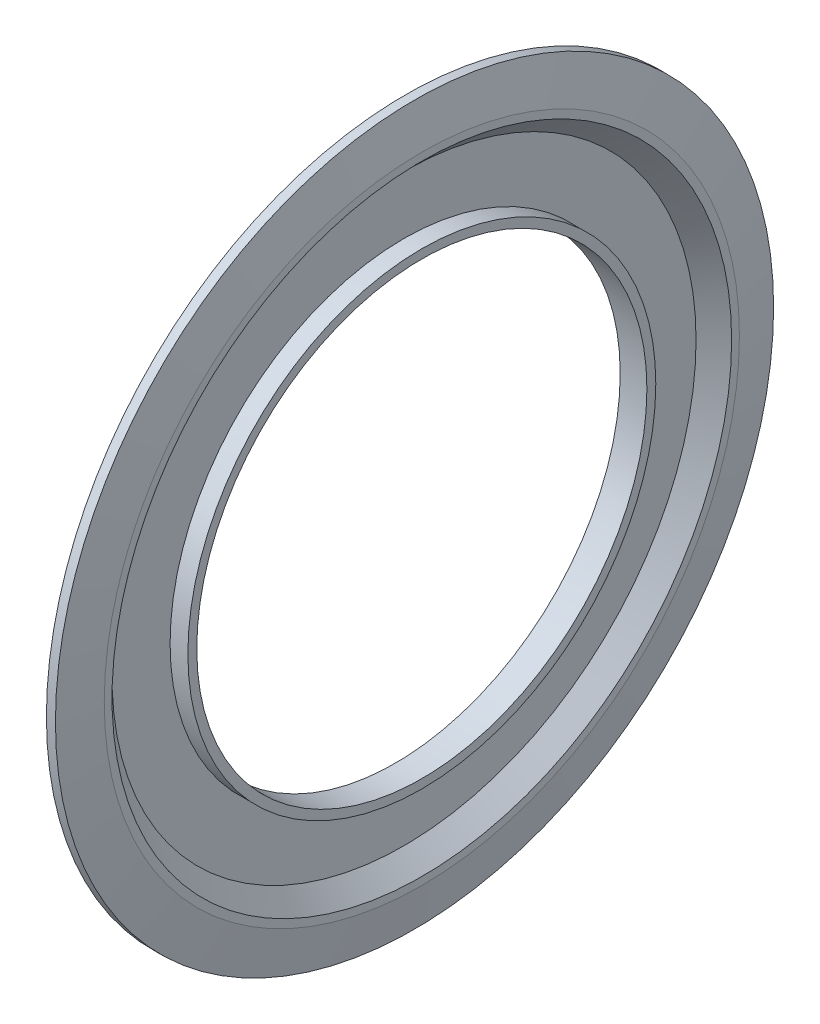
ISO-10303-21;
HEADER;
FILE_DESCRIPTION(('STEP AP214'),'2;1');
FILE_NAME('part.step','',(''),(''),'','','');
FILE_SCHEMA(('AUTOMOTIVE_DESIGN { 1 0 10303 214 1 1 1 1 }'));
ENDSEC;
DATA;
#1=APPLICATION_CONTEXT('core data for automotive mechanical design processes');
#2=APPLICATION_PROTOCOL_DEFINITION('international standard','automotive_design',2000,#1);
#3=PRODUCT_CONTEXT('',#1,'mechanical');
#4=PRODUCT('Part','Part','',(#3));
#5=PRODUCT_RELATED_PRODUCT_CATEGORY('part','',(#4));
#6=PRODUCT_DEFINITION_FORMATION('','',#4);
#7=PRODUCT_DEFINITION_CONTEXT('part definition',#1,'design');
#8=PRODUCT_DEFINITION('design','',#6,#7);
#9=PRODUCT_DEFINITION_SHAPE('','',#8);
#10=(LENGTH_UNIT() NAMED_UNIT(*) SI_UNIT(.MILLI.,.METRE.));
#11=(NAMED_UNIT(*) PLANE_ANGLE_UNIT() SI_UNIT($,.RADIAN.));
#12=(NAMED_UNIT(*) SI_UNIT($,.STERADIAN.) SOLID_ANGLE_UNIT());
#13=UNCERTAINTY_MEASURE_WITH_UNIT(LENGTH_MEASURE(1.E-05),#10,'distance_accuracy_value','');
#14=(GEOMETRIC_REPRESENTATION_CONTEXT(3) GLOBAL_UNCERTAINTY_ASSIGNED_CONTEXT((#13)) GLOBAL_UNIT_ASSIGNED_CONTEXT((#10,
#11,#12)) REPRESENTATION_CONTEXT('',''));
#15=CARTESIAN_POINT('',(0.,0.,0.));
#16=DIRECTION('',(0.,0.,1.));
#17=DIRECTION('',(1.,0.,0.));
#18=AXIS2_PLACEMENT_3D('',#15,#16,#17);
#19=CARTESIAN_POINT('',(0.410776862183425,0.,0.));
#20=DIRECTION('',(-1.,0.,0.));
#21=DIRECTION('',(0.,0.,1.));
#22=AXIS2_PLACEMENT_3D('',#19,#20,#21);
#23=CONICAL_SURFACE('',#22,3.75,1.39626340159546);
#24=CARTESIAN_POINT('',(0.324376641636277,0.,0.));
#25=DIRECTION('',(1.,0.,0.));
#26=DIRECTION('',(0.,0.,-1.));
#27=AXIS2_PLACEMENT_3D('',#24,#25,#26);
#28=CIRCLE('',#27,4.24);
#29=CARTESIAN_POINT('',(0.324376641636278,0.,-4.24));
#30=VERTEX_POINT('',#29);
#31=EDGE_CURVE('E71',#30,#30,#28,.T.);
#32=ORIENTED_EDGE('',*,*,#31,.T.);
#33=EDGE_LOOP('',(#32));
#34=FACE_BOUND('',#33,.T.);
#35=CARTESIAN_POINT('',(0.410776862183425,0.,0.));
#36=DIRECTION('',(1.,0.,0.));
#37=DIRECTION('',(0.,0.,-1.));
#38=AXIS2_PLACEMENT_3D('',#35,#36,#37);
#39=CIRCLE('',#38,3.75);
#40=CARTESIAN_POINT('',(0.410776862183425,0.,-3.75));
#41=VERTEX_POINT('',#40);
#42=EDGE_CURVE('E10',#41,#41,#39,.T.);
#43=ORIENTED_EDGE('',*,*,#42,.F.);
#44=EDGE_LOOP('',(#43));
#45=FACE_BOUND('',#44,.T.);
#46=ADVANCED_FACE('F14',(#34,#45),#23,.T.);
#47=CARTESIAN_POINT('',(0.410776862183425,3.75,0.));
#48=DIRECTION('',(-1.,0.,0.));
#49=DIRECTION('',(0.,0.,1.));
#50=AXIS2_PLACEMENT_3D('',#47,#48,#49);
#51=PLANE('',#50);
#52=CARTESIAN_POINT('',(0.410776862183425,0.,0.));
#53=DIRECTION('',(1.,0.,0.));
#54=DIRECTION('',(0.,0.,-1.));
#55=AXIS2_PLACEMENT_3D('',#52,#53,#54);
#56=CIRCLE('',#55,3.658);
#57=CARTESIAN_POINT('',(0.410776862183425,0.,-3.658));
#58=VERTEX_POINT('',#57);
#59=EDGE_CURVE('E21',#58,#58,#56,.T.);
#60=ORIENTED_EDGE('',*,*,#59,.F.);
#61=EDGE_LOOP('',(#60));
#62=FACE_BOUND('',#61,.T.);
#63=ORIENTED_EDGE('',*,*,#42,.T.);
#64=EDGE_LOOP('',(#63));
#65=FACE_BOUND('',#64,.T.);
#66=ADVANCED_FACE('F92',(#62,#65),#51,.F.);
#67=CARTESIAN_POINT('',(0.200776862183426,0.,0.));
#68=DIRECTION('',(1.,0.,0.));
#69=DIRECTION('',(0.,0.,-1.));
#70=AXIS2_PLACEMENT_3D('',#67,#68,#69);
#71=CONICAL_SURFACE('',#70,3.448,0.785398163397448);
#72=ORIENTED_EDGE('',*,*,#59,.T.);
#73=EDGE_LOOP('',(#72));
#74=FACE_BOUND('',#73,.T.);
#75=CARTESIAN_POINT('',(0.200776862183426,0.,0.));
#76=DIRECTION('',(1.,0.,0.));
#77=DIRECTION('',(0.,0.,-1.));
#78=AXIS2_PLACEMENT_3D('',#75,#76,#77);
#79=CIRCLE('',#78,3.448);
#80=CARTESIAN_POINT('',(0.200776862183426,0.,-3.448));
#81=VERTEX_POINT('',#80);
#82=EDGE_CURVE('E30',#81,#81,#79,.T.);
#83=ORIENTED_EDGE('',*,*,#82,.F.);
#84=EDGE_LOOP('',(#83));
#85=FACE_BOUND('',#84,.T.);
#86=ADVANCED_FACE('F96',(#74,#85),#71,.F.);
#87=CARTESIAN_POINT('',(0.200776862183426,2.7625,0.));
#88=DIRECTION('',(1.,0.,0.));
#89=DIRECTION('',(0.,0.,-1.));
#90=AXIS2_PLACEMENT_3D('',#87,#88,#89);
#91=PLANE('',#90);
#92=ORIENTED_EDGE('',*,*,#82,.T.);
#93=EDGE_LOOP('',(#92));
#94=FACE_BOUND('',#93,.T.);
#95=CARTESIAN_POINT('',(0.200776862183426,0.,0.));
#96=DIRECTION('',(1.,0.,0.));
#97=DIRECTION('',(0.,0.,-1.));
#98=AXIS2_PLACEMENT_3D('',#95,#96,#97);
#99=CIRCLE('',#98,2.7625);
#100=CARTESIAN_POINT('',(0.200776862183426,0.,-2.7625));
#101=VERTEX_POINT('',#100);
#102=EDGE_CURVE('E37',#101,#101,#99,.T.);
#103=ORIENTED_EDGE('',*,*,#102,.F.);
#104=EDGE_LOOP('',(#103));
#105=FACE_BOUND('',#104,.T.);
#106=ADVANCED_FACE('F101',(#94,#105),#91,.T.);
#107=CARTESIAN_POINT('',(0.410776862183425,0.,0.));
#108=DIRECTION('',(1.,0.,0.));
#109=DIRECTION('',(0.,0.,-1.));
#110=AXIS2_PLACEMENT_3D('',#107,#108,#109);
#111=CYLINDRICAL_SURFACE('',#110,2.7625);
#112=ORIENTED_EDGE('',*,*,#102,.T.);
#113=EDGE_LOOP('',(#112));
#114=FACE_BOUND('',#113,.T.);
#115=CARTESIAN_POINT('',(0.410776862183425,0.,0.));
#116=DIRECTION('',(1.,0.,0.));
#117=DIRECTION('',(0.,0.,-1.));
#118=AXIS2_PLACEMENT_3D('',#115,#116,#117);
#119=CIRCLE('',#118,2.7625);
#120=CARTESIAN_POINT('',(0.410776862183425,0.,-2.7625));
#121=VERTEX_POINT('',#120);
#122=EDGE_CURVE('E43',#121,#121,#119,.T.);
#123=ORIENTED_EDGE('',*,*,#122,.F.);
#124=EDGE_LOOP('',(#123));
#125=FACE_BOUND('',#124,.T.);
#126=ADVANCED_FACE('F106',(#114,#125),#111,.T.);
#127=CARTESIAN_POINT('',(0.410776862183425,2.6575,0.));
#128=DIRECTION('',(1.,0.,0.));
#129=DIRECTION('',(0.,0.,-1.));
#130=AXIS2_PLACEMENT_3D('',#127,#128,#129);
#131=PLANE('',#130);
#132=ORIENTED_EDGE('',*,*,#122,.T.);
#133=EDGE_LOOP('',(#132));
#134=FACE_BOUND('',#133,.T.);
#135=CARTESIAN_POINT('',(0.410776862183425,0.,0.));
#136=DIRECTION('',(1.,0.,0.));
#137=DIRECTION('',(0.,0.,-1.));
#138=AXIS2_PLACEMENT_3D('',#135,#136,#137);
#139=CIRCLE('',#138,2.6575);
#140=CARTESIAN_POINT('',(0.410776862183425,0.,-2.6575));
#141=VERTEX_POINT('',#140);
#142=EDGE_CURVE('E47',#141,#141,#139,.T.);
#143=ORIENTED_EDGE('',*,*,#142,.F.);
#144=EDGE_LOOP('',(#143));
#145=FACE_BOUND('',#144,.T.);
#146=ADVANCED_FACE('F110',(#134,#145),#131,.T.);
#147=CARTESIAN_POINT('',(0.410776862183425,0.,0.));
#148=DIRECTION('',(1.,0.,0.));
#149=DIRECTION('',(0.,0.,-1.));
#150=AXIS2_PLACEMENT_3D('',#147,#148,#149);
#151=CYLINDRICAL_SURFACE('',#150,2.6575);
#152=CARTESIAN_POINT('',(0.0957768621834254,0.,0.));
#153=DIRECTION('',(1.,0.,0.));
#154=DIRECTION('',(0.,0.,-1.));
#155=AXIS2_PLACEMENT_3D('',#152,#153,#154);
#156=CIRCLE('',#155,2.6575);
#157=CARTESIAN_POINT('',(0.0957768621834257,0.,-2.6575));
#158=VERTEX_POINT('',#157);
#159=EDGE_CURVE('E51',#158,#158,#156,.T.);
#160=ORIENTED_EDGE('',*,*,#159,.F.);
#161=EDGE_LOOP('',(#160));
#162=FACE_BOUND('',#161,.T.);
#163=ORIENTED_EDGE('',*,*,#142,.T.);
#164=EDGE_LOOP('',(#163));
#165=FACE_BOUND('',#164,.T.);
#166=ADVANCED_FACE('F114',(#162,#165),#151,.F.);
#167=CARTESIAN_POINT('',(0.0957768621834254,2.6575,0.));
#168=DIRECTION('',(1.,0.,0.));
#169=DIRECTION('',(0.,0.,-1.));
#170=AXIS2_PLACEMENT_3D('',#167,#168,#169);
#171=PLANE('',#170);
#172=CARTESIAN_POINT('',(0.0957768621834254,0.,0.));
#173=DIRECTION('',(1.,0.,0.));
#174=DIRECTION('',(0.,0.,-1.));
#175=AXIS2_PLACEMENT_3D('',#172,#173,#174);
#176=CIRCLE('',#175,3.49149242404918);
#177=CARTESIAN_POINT('',(0.0957768621834258,0.,-3.49149242404918));
#178=VERTEX_POINT('',#177);
#179=EDGE_CURVE('E55',#178,#178,#176,.T.);
#180=ORIENTED_EDGE('',*,*,#179,.F.);
#181=EDGE_LOOP('',(#180));
#182=FACE_BOUND('',#181,.T.);
#183=ORIENTED_EDGE('',*,*,#159,.T.);
#184=EDGE_LOOP('',(#183));
#185=FACE_BOUND('',#184,.T.);
#186=ADVANCED_FACE('F118',(#182,#185),#171,.F.);
#187=CARTESIAN_POINT('',(0.0957768621834254,0.,0.));
#188=DIRECTION('',(1.,0.,0.));
#189=DIRECTION('',(0.,0.,-1.));
#190=AXIS2_PLACEMENT_3D('',#187,#188,#189);
#191=CONICAL_SURFACE('',#190,3.49149242404918,0.785398163397448);
#192=CARTESIAN_POINT('',(0.305776862183425,0.,0.));
#193=DIRECTION('',(1.,0.,0.));
#194=DIRECTION('',(0.,0.,-1.));
#195=AXIS2_PLACEMENT_3D('',#192,#193,#194);
#196=CIRCLE('',#195,3.70149242404917);
#197=CARTESIAN_POINT('',(0.305776862183425,0.,-3.70149242404917));
#198=VERTEX_POINT('',#197);
#199=EDGE_CURVE('E59',#198,#198,#196,.T.);
#200=ORIENTED_EDGE('',*,*,#199,.F.);
#201=EDGE_LOOP('',(#200));
#202=FACE_BOUND('',#201,.T.);
#203=ORIENTED_EDGE('',*,*,#179,.T.);
#204=EDGE_LOOP('',(#203));
#205=FACE_BOUND('',#204,.T.);
#206=ADVANCED_FACE('F122',(#202,#205),#191,.T.);
#207=CARTESIAN_POINT('',(0.305776862183425,3.70149242404917,0.));
#208=DIRECTION('',(1.,0.,0.));
#209=DIRECTION('',(0.,0.,-1.));
#210=AXIS2_PLACEMENT_3D('',#207,#208,#209);
#211=PLANE('',#210);
#212=CARTESIAN_POINT('',(0.305776862183425,0.,0.));
#213=DIRECTION('',(1.,0.,0.));
#214=DIRECTION('',(0.,0.,-1.));
#215=AXIS2_PLACEMENT_3D('',#212,#213,#214);
#216=CIRCLE('',#215,3.74081369032978);
#217=CARTESIAN_POINT('',(0.305776862183425,0.,-3.74081369032978));
#218=VERTEX_POINT('',#217);
#219=EDGE_CURVE('E63',#218,#218,#216,.T.);
#220=ORIENTED_EDGE('',*,*,#219,.F.);
#221=EDGE_LOOP('',(#220));
#222=FACE_BOUND('',#221,.T.);
#223=ORIENTED_EDGE('',*,*,#199,.T.);
#224=EDGE_LOOP('',(#223));
#225=FACE_BOUND('',#224,.T.);
#226=ADVANCED_FACE('F88',(#222,#225),#211,.F.);
#227=CARTESIAN_POINT('',(0.305776862183425,0.,0.));
#228=DIRECTION('',(-1.,0.,0.));
#229=DIRECTION('',(0.,0.,1.));
#230=AXIS2_PLACEMENT_3D('',#227,#228,#229);
#231=CONICAL_SURFACE('',#230,3.74081369032978,1.39626340159546);
#232=CARTESIAN_POINT('',(0.217756847388274,0.,0.));
#233=DIRECTION('',(1.,0.,0.));
#234=DIRECTION('',(0.,0.,-1.));
#235=AXIS2_PLACEMENT_3D('',#232,#233,#234);
#236=CIRCLE('',#235,4.24);
#237=CARTESIAN_POINT('',(0.217756847388274,0.,-4.24));
#238=VERTEX_POINT('',#237);
#239=EDGE_CURVE('E67',#238,#238,#236,.T.);
#240=ORIENTED_EDGE('',*,*,#239,.F.);
#241=EDGE_LOOP('',(#240));
#242=FACE_BOUND('',#241,.T.);
#243=ORIENTED_EDGE('',*,*,#219,.T.);
#244=EDGE_LOOP('',(#243));
#245=FACE_BOUND('',#244,.T.);
#246=ADVANCED_FACE('F81',(#242,#245),#231,.F.);
#247=CARTESIAN_POINT('',(0.410776862183425,0.,0.));
#248=DIRECTION('',(1.,0.,0.));
#249=DIRECTION('',(0.,0.,-1.));
#250=AXIS2_PLACEMENT_3D('',#247,#248,#249);
#251=CYLINDRICAL_SURFACE('',#250,4.24);
#252=ORIENTED_EDGE('',*,*,#239,.T.);
#253=EDGE_LOOP('',(#252));
#254=FACE_BOUND('',#253,.T.);
#255=ORIENTED_EDGE('',*,*,#31,.F.);
#256=EDGE_LOOP('',(#255));
#257=FACE_BOUND('',#256,.T.);
#258=ADVANCED_FACE('F79',(#254,#257),#251,.T.);
#259=CLOSED_SHELL('',(#46,#66,#86,#106,#126,#146,#166,#186,#206,#226,#246,#258));
#260=MANIFOLD_SOLID_BREP('B1',#259);
#261=ADVANCED_BREP_SHAPE_REPRESENTATION('',(#18,#260),#14);
#262=SHAPE_DEFINITION_REPRESENTATION(#9,#261);
ENDSEC;
END-ISO-10303-21;
